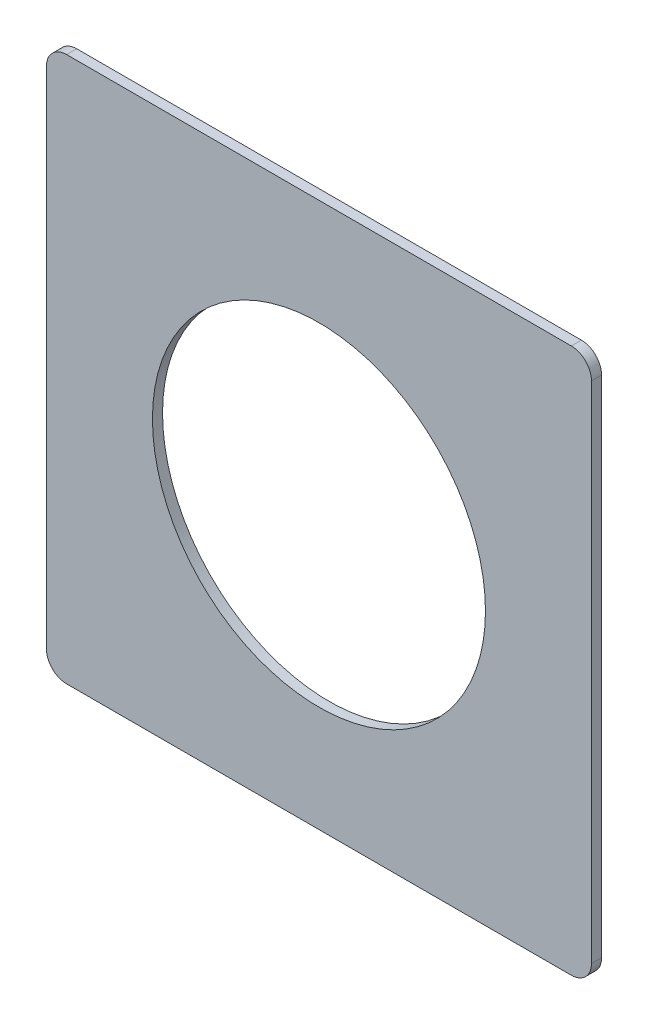
ISO-10303-21;
HEADER;
FILE_DESCRIPTION(('STEP AP214'),'2;1');
FILE_NAME('part.step','',(''),(''),'','','');
FILE_SCHEMA(('AUTOMOTIVE_DESIGN { 1 0 10303 214 1 1 1 1 }'));
ENDSEC;
DATA;
#1=APPLICATION_CONTEXT('core data for automotive mechanical design processes');
#2=APPLICATION_PROTOCOL_DEFINITION('international standard','automotive_design',2000,#1);
#3=PRODUCT_CONTEXT('',#1,'mechanical');
#4=PRODUCT('Part','Part','',(#3));
#5=PRODUCT_RELATED_PRODUCT_CATEGORY('part','',(#4));
#6=PRODUCT_DEFINITION_FORMATION('','',#4);
#7=PRODUCT_DEFINITION_CONTEXT('part definition',#1,'design');
#8=PRODUCT_DEFINITION('design','',#6,#7);
#9=PRODUCT_DEFINITION_SHAPE('','',#8);
#10=(LENGTH_UNIT() NAMED_UNIT(*) SI_UNIT(.MILLI.,.METRE.));
#11=(NAMED_UNIT(*) PLANE_ANGLE_UNIT() SI_UNIT($,.RADIAN.));
#12=(NAMED_UNIT(*) SI_UNIT($,.STERADIAN.) SOLID_ANGLE_UNIT());
#13=UNCERTAINTY_MEASURE_WITH_UNIT(LENGTH_MEASURE(1.E-05),#10,'distance_accuracy_value','');
#14=(GEOMETRIC_REPRESENTATION_CONTEXT(3) GLOBAL_UNCERTAINTY_ASSIGNED_CONTEXT((#13)) GLOBAL_UNIT_ASSIGNED_CONTEXT((#10,
#11,#12)) REPRESENTATION_CONTEXT('',''));
#15=CARTESIAN_POINT('',(0.,0.,0.));
#16=DIRECTION('',(0.,0.,1.));
#17=DIRECTION('',(1.,0.,0.));
#18=AXIS2_PLACEMENT_3D('',#15,#16,#17);
#19=CARTESIAN_POINT('',(158.75,158.75,6.35));
#20=DIRECTION('',(0.,0.,-1.));
#21=DIRECTION('',(-1.,0.,0.));
#22=AXIS2_PLACEMENT_3D('',#19,#20,#21);
#23=CYLINDRICAL_SURFACE('',#22,12.7);
#24=CARTESIAN_POINT('',(158.75,158.75,0.));
#25=DIRECTION('',(0.,0.,1.));
#26=DIRECTION('',(-1.,0.,0.));
#27=AXIS2_PLACEMENT_3D('',#24,#25,#26);
#28=CIRCLE('',#27,12.7);
#29=CARTESIAN_POINT('',(171.45,158.75,0.));
#30=VERTEX_POINT('',#29);
#31=CARTESIAN_POINT('',(158.75,171.45,0.));
#32=VERTEX_POINT('',#31);
#33=EDGE_CURVE('E135',#30,#32,#28,.T.);
#34=ORIENTED_EDGE('',*,*,#33,.T.);
#35=DIRECTION('',(0.,0.,-1.));
#36=VECTOR('',#35,1.);
#37=CARTESIAN_POINT('',(158.75,171.45,6.35));
#38=LINE('',#37,#36);
#39=CARTESIAN_POINT('',(158.75,171.45,6.35));
#40=VERTEX_POINT('',#39);
#41=EDGE_CURVE('E11',#40,#32,#38,.T.);
#42=ORIENTED_EDGE('',*,*,#41,.F.);
#43=CARTESIAN_POINT('',(158.75,158.75,6.35));
#44=DIRECTION('',(0.,0.,1.));
#45=DIRECTION('',(-1.,0.,0.));
#46=AXIS2_PLACEMENT_3D('',#43,#44,#45);
#47=CIRCLE('',#46,12.7);
#48=CARTESIAN_POINT('',(171.45,158.75,6.35));
#49=VERTEX_POINT('',#48);
#50=EDGE_CURVE('E150',#49,#40,#47,.T.);
#51=ORIENTED_EDGE('',*,*,#50,.F.);
#52=DIRECTION('',(0.,0.,-1.));
#53=VECTOR('',#52,1.);
#54=CARTESIAN_POINT('',(171.45,158.75,6.35));
#55=LINE('',#54,#53);
#56=EDGE_CURVE('E131',#49,#30,#55,.T.);
#57=ORIENTED_EDGE('',*,*,#56,.T.);
#58=EDGE_LOOP('',(#34,#42,#51,#57));
#59=FACE_BOUND('',#58,.T.);
#60=ADVANCED_FACE('F39',(#59),#23,.T.);
#61=CARTESIAN_POINT('',(-158.75,171.45,6.35));
#62=DIRECTION('',(0.,-1.,0.));
#63=DIRECTION('',(0.,0.,-1.));
#64=AXIS2_PLACEMENT_3D('',#61,#62,#63);
#65=PLANE('',#64);
#66=DIRECTION('',(-1.,0.,0.));
#67=VECTOR('',#66,1.);
#68=CARTESIAN_POINT('',(-158.75,171.45,0.));
#69=LINE('',#68,#67);
#70=CARTESIAN_POINT('',(-158.75,171.45,0.));
#71=VERTEX_POINT('',#70);
#72=EDGE_CURVE('E138',#32,#71,#69,.T.);
#73=ORIENTED_EDGE('',*,*,#72,.T.);
#74=DIRECTION('',(0.,0.,-1.));
#75=VECTOR('',#74,1.);
#76=CARTESIAN_POINT('',(-158.75,171.45,6.35));
#77=LINE('',#76,#75);
#78=CARTESIAN_POINT('',(-158.75,171.45,6.35));
#79=VERTEX_POINT('',#78);
#80=EDGE_CURVE('E47',#79,#71,#77,.T.);
#81=ORIENTED_EDGE('',*,*,#80,.F.);
#82=DIRECTION('',(-1.,0.,0.));
#83=VECTOR('',#82,1.);
#84=CARTESIAN_POINT('',(-158.75,171.45,6.35));
#85=LINE('',#84,#83);
#86=EDGE_CURVE('E98',#40,#79,#85,.T.);
#87=ORIENTED_EDGE('',*,*,#86,.F.);
#88=ORIENTED_EDGE('',*,*,#41,.T.);
#89=EDGE_LOOP('',(#73,#81,#87,#88));
#90=FACE_BOUND('',#89,.T.);
#91=ADVANCED_FACE('F206',(#90),#65,.F.);
#92=CARTESIAN_POINT('',(-158.75,158.75,6.35));
#93=DIRECTION('',(0.,0.,-1.));
#94=DIRECTION('',(-1.,0.,0.));
#95=AXIS2_PLACEMENT_3D('',#92,#93,#94);
#96=CYLINDRICAL_SURFACE('',#95,12.7);
#97=CARTESIAN_POINT('',(-158.75,158.75,0.));
#98=DIRECTION('',(0.,0.,1.));
#99=DIRECTION('',(1.,0.,0.));
#100=AXIS2_PLACEMENT_3D('',#97,#98,#99);
#101=CIRCLE('',#100,12.7);
#102=CARTESIAN_POINT('',(-171.45,158.75,0.));
#103=VERTEX_POINT('',#102);
#104=EDGE_CURVE('E141',#71,#103,#101,.T.);
#105=ORIENTED_EDGE('',*,*,#104,.T.);
#106=DIRECTION('',(0.,0.,-1.));
#107=VECTOR('',#106,1.);
#108=CARTESIAN_POINT('',(-171.45,158.75,6.35));
#109=LINE('',#108,#107);
#110=CARTESIAN_POINT('',(-171.45,158.75,6.35));
#111=VERTEX_POINT('',#110);
#112=EDGE_CURVE('E157',#111,#103,#109,.T.);
#113=ORIENTED_EDGE('',*,*,#112,.F.);
#114=CARTESIAN_POINT('',(-158.75,158.75,6.35));
#115=DIRECTION('',(0.,0.,1.));
#116=DIRECTION('',(1.,0.,0.));
#117=AXIS2_PLACEMENT_3D('',#114,#115,#116);
#118=CIRCLE('',#117,12.7);
#119=EDGE_CURVE('E165',#79,#111,#118,.T.);
#120=ORIENTED_EDGE('',*,*,#119,.F.);
#121=ORIENTED_EDGE('',*,*,#80,.T.);
#122=EDGE_LOOP('',(#105,#113,#120,#121));
#123=FACE_BOUND('',#122,.T.);
#124=ADVANCED_FACE('F163',(#123),#96,.T.);
#125=CARTESIAN_POINT('',(-171.45,158.75,6.35));
#126=DIRECTION('',(1.,0.,0.));
#127=DIRECTION('',(0.,0.,-1.));
#128=AXIS2_PLACEMENT_3D('',#125,#126,#127);
#129=PLANE('',#128);
#130=DIRECTION('',(0.,-1.,0.));
#131=VECTOR('',#130,1.);
#132=CARTESIAN_POINT('',(-171.45,158.75,0.));
#133=LINE('',#132,#131);
#134=CARTESIAN_POINT('',(-171.45,-158.75,0.));
#135=VERTEX_POINT('',#134);
#136=EDGE_CURVE('E143',#103,#135,#133,.T.);
#137=ORIENTED_EDGE('',*,*,#136,.T.);
#138=DIRECTION('',(0.,0.,-1.));
#139=VECTOR('',#138,1.);
#140=CARTESIAN_POINT('',(-171.45,-158.75,6.35));
#141=LINE('',#140,#139);
#142=CARTESIAN_POINT('',(-171.45,-158.75,6.35));
#143=VERTEX_POINT('',#142);
#144=EDGE_CURVE('E154',#143,#135,#141,.T.);
#145=ORIENTED_EDGE('',*,*,#144,.F.);
#146=DIRECTION('',(0.,-1.,0.));
#147=VECTOR('',#146,1.);
#148=CARTESIAN_POINT('',(-171.45,158.75,6.35));
#149=LINE('',#148,#147);
#150=EDGE_CURVE('E177',#111,#143,#149,.T.);
#151=ORIENTED_EDGE('',*,*,#150,.F.);
#152=ORIENTED_EDGE('',*,*,#112,.T.);
#153=EDGE_LOOP('',(#137,#145,#151,#152));
#154=FACE_BOUND('',#153,.T.);
#155=ADVANCED_FACE('F173',(#154),#129,.F.);
#156=CARTESIAN_POINT('',(-158.75,-158.75,6.35));
#157=DIRECTION('',(0.,0.,-1.));
#158=DIRECTION('',(-1.,0.,0.));
#159=AXIS2_PLACEMENT_3D('',#156,#157,#158);
#160=CYLINDRICAL_SURFACE('',#159,12.7);
#161=CARTESIAN_POINT('',(-158.75,-158.75,0.));
#162=DIRECTION('',(0.,0.,1.));
#163=DIRECTION('',(1.,0.,0.));
#164=AXIS2_PLACEMENT_3D('',#161,#162,#163);
#165=CIRCLE('',#164,12.7);
#166=CARTESIAN_POINT('',(-158.75,-171.45,0.));
#167=VERTEX_POINT('',#166);
#168=EDGE_CURVE('E145',#135,#167,#165,.T.);
#169=ORIENTED_EDGE('',*,*,#168,.T.);
#170=DIRECTION('',(0.,0.,-1.));
#171=VECTOR('',#170,1.);
#172=CARTESIAN_POINT('',(-158.75,-171.45,6.35));
#173=LINE('',#172,#171);
#174=CARTESIAN_POINT('',(-158.75,-171.45,6.35));
#175=VERTEX_POINT('',#174);
#176=EDGE_CURVE('E126',#175,#167,#173,.T.);
#177=ORIENTED_EDGE('',*,*,#176,.F.);
#178=CARTESIAN_POINT('',(-158.75,-158.75,6.35));
#179=DIRECTION('',(0.,0.,1.));
#180=DIRECTION('',(1.,0.,0.));
#181=AXIS2_PLACEMENT_3D('',#178,#179,#180);
#182=CIRCLE('',#181,12.7);
#183=EDGE_CURVE('E117',#143,#175,#182,.T.);
#184=ORIENTED_EDGE('',*,*,#183,.F.);
#185=ORIENTED_EDGE('',*,*,#144,.T.);
#186=EDGE_LOOP('',(#169,#177,#184,#185));
#187=FACE_BOUND('',#186,.T.);
#188=ADVANCED_FACE('F176',(#187),#160,.T.);
#189=CARTESIAN_POINT('',(-158.75,-171.45,6.35));
#190=DIRECTION('',(0.,1.,0.));
#191=DIRECTION('',(0.,0.,1.));
#192=AXIS2_PLACEMENT_3D('',#189,#190,#191);
#193=PLANE('',#192);
#194=DIRECTION('',(1.,0.,0.));
#195=VECTOR('',#194,1.);
#196=CARTESIAN_POINT('',(-158.75,-171.45,0.));
#197=LINE('',#196,#195);
#198=CARTESIAN_POINT('',(158.75,-171.45,0.));
#199=VERTEX_POINT('',#198);
#200=EDGE_CURVE('E125',#167,#199,#197,.T.);
#201=ORIENTED_EDGE('',*,*,#200,.T.);
#202=DIRECTION('',(0.,0.,-1.));
#203=VECTOR('',#202,1.);
#204=CARTESIAN_POINT('',(158.75,-171.45,6.35));
#205=LINE('',#204,#203);
#206=CARTESIAN_POINT('',(158.75,-171.45,6.35));
#207=VERTEX_POINT('',#206);
#208=EDGE_CURVE('E122',#207,#199,#205,.T.);
#209=ORIENTED_EDGE('',*,*,#208,.F.);
#210=DIRECTION('',(1.,0.,0.));
#211=VECTOR('',#210,1.);
#212=CARTESIAN_POINT('',(-158.75,-171.45,6.35));
#213=LINE('',#212,#211);
#214=EDGE_CURVE('E111',#175,#207,#213,.T.);
#215=ORIENTED_EDGE('',*,*,#214,.F.);
#216=ORIENTED_EDGE('',*,*,#176,.T.);
#217=EDGE_LOOP('',(#201,#209,#215,#216));
#218=FACE_BOUND('',#217,.T.);
#219=ADVANCED_FACE('F123',(#218),#193,.F.);
#220=CARTESIAN_POINT('',(158.75,-158.75,6.35));
#221=DIRECTION('',(0.,0.,-1.));
#222=DIRECTION('',(-1.,0.,0.));
#223=AXIS2_PLACEMENT_3D('',#220,#221,#222);
#224=CYLINDRICAL_SURFACE('',#223,12.7);
#225=CARTESIAN_POINT('',(158.75,-158.75,0.));
#226=DIRECTION('',(0.,0.,1.));
#227=DIRECTION('',(1.,0.,0.));
#228=AXIS2_PLACEMENT_3D('',#225,#226,#227);
#229=CIRCLE('',#228,12.7);
#230=CARTESIAN_POINT('',(171.45,-158.75,0.));
#231=VERTEX_POINT('',#230);
#232=EDGE_CURVE('E84',#199,#231,#229,.T.);
#233=ORIENTED_EDGE('',*,*,#232,.T.);
#234=DIRECTION('',(0.,0.,-1.));
#235=VECTOR('',#234,1.);
#236=CARTESIAN_POINT('',(171.45,-158.75,6.35));
#237=LINE('',#236,#235);
#238=CARTESIAN_POINT('',(171.45,-158.75,6.35));
#239=VERTEX_POINT('',#238);
#240=EDGE_CURVE('E127',#239,#231,#237,.T.);
#241=ORIENTED_EDGE('',*,*,#240,.F.);
#242=CARTESIAN_POINT('',(158.75,-158.75,6.35));
#243=DIRECTION('',(0.,0.,1.));
#244=DIRECTION('',(1.,0.,0.));
#245=AXIS2_PLACEMENT_3D('',#242,#243,#244);
#246=CIRCLE('',#245,12.7);
#247=EDGE_CURVE('E115',#207,#239,#246,.T.);
#248=ORIENTED_EDGE('',*,*,#247,.F.);
#249=ORIENTED_EDGE('',*,*,#208,.T.);
#250=EDGE_LOOP('',(#233,#241,#248,#249));
#251=FACE_BOUND('',#250,.T.);
#252=ADVANCED_FACE('F129',(#251),#224,.T.);
#253=CARTESIAN_POINT('',(171.45,158.75,6.35));
#254=DIRECTION('',(-1.,0.,0.));
#255=DIRECTION('',(0.,0.,1.));
#256=AXIS2_PLACEMENT_3D('',#253,#254,#255);
#257=PLANE('',#256);
#258=DIRECTION('',(0.,1.,0.));
#259=VECTOR('',#258,1.);
#260=CARTESIAN_POINT('',(171.45,158.75,0.));
#261=LINE('',#260,#259);
#262=EDGE_CURVE('E90',#231,#30,#261,.T.);
#263=ORIENTED_EDGE('',*,*,#262,.T.);
#264=ORIENTED_EDGE('',*,*,#56,.F.);
#265=DIRECTION('',(0.,1.,0.));
#266=VECTOR('',#265,1.);
#267=CARTESIAN_POINT('',(171.45,158.75,6.35));
#268=LINE('',#267,#266);
#269=EDGE_CURVE('E55',#239,#49,#268,.T.);
#270=ORIENTED_EDGE('',*,*,#269,.F.);
#271=ORIENTED_EDGE('',*,*,#240,.T.);
#272=EDGE_LOOP('',(#263,#264,#270,#271));
#273=FACE_BOUND('',#272,.T.);
#274=ADVANCED_FACE('F197',(#273),#257,.F.);
#275=CARTESIAN_POINT('',(158.75,158.75,6.35));
#276=DIRECTION('',(0.,0.,-1.));
#277=DIRECTION('',(-1.,0.,0.));
#278=AXIS2_PLACEMENT_3D('',#275,#276,#277);
#279=PLANE('',#278);
#280=CARTESIAN_POINT('',(0.,0.,6.35));
#281=DIRECTION('',(0.,0.,1.));
#282=DIRECTION('',(1.,0.,0.));
#283=AXIS2_PLACEMENT_3D('',#280,#281,#282);
#284=CIRCLE('',#283,104.764774546973);
#285=CARTESIAN_POINT('',(104.764774546973,0.,6.35));
#286=VERTEX_POINT('',#285);
#287=EDGE_CURVE('E183',#286,#286,#284,.T.);
#288=ORIENTED_EDGE('',*,*,#287,.F.);
#289=EDGE_LOOP('',(#288));
#290=FACE_BOUND('',#289,.T.);
#291=ORIENTED_EDGE('',*,*,#50,.T.);
#292=ORIENTED_EDGE('',*,*,#86,.T.);
#293=ORIENTED_EDGE('',*,*,#119,.T.);
#294=ORIENTED_EDGE('',*,*,#150,.T.);
#295=ORIENTED_EDGE('',*,*,#183,.T.);
#296=ORIENTED_EDGE('',*,*,#214,.T.);
#297=ORIENTED_EDGE('',*,*,#247,.T.);
#298=ORIENTED_EDGE('',*,*,#269,.T.);
#299=EDGE_LOOP('',(#291,#292,#293,#294,#295,#296,#297,#298));
#300=FACE_BOUND('',#299,.T.);
#301=ADVANCED_FACE('F113',(#290,#300),#279,.F.);
#302=CARTESIAN_POINT('',(158.75,158.75,0.));
#303=DIRECTION('',(0.,0.,-1.));
#304=DIRECTION('',(-1.,0.,0.));
#305=AXIS2_PLACEMENT_3D('',#302,#303,#304);
#306=PLANE('',#305);
#307=CARTESIAN_POINT('',(0.,0.,0.));
#308=DIRECTION('',(0.,0.,1.));
#309=DIRECTION('',(1.,0.,0.));
#310=AXIS2_PLACEMENT_3D('',#307,#308,#309);
#311=CIRCLE('',#310,104.764774546973);
#312=CARTESIAN_POINT('',(104.764774546973,0.,0.));
#313=VERTEX_POINT('',#312);
#314=EDGE_CURVE('E139',#313,#313,#311,.T.);
#315=ORIENTED_EDGE('',*,*,#314,.T.);
#316=EDGE_LOOP('',(#315));
#317=FACE_BOUND('',#316,.T.);
#318=ORIENTED_EDGE('',*,*,#33,.F.);
#319=ORIENTED_EDGE('',*,*,#262,.F.);
#320=ORIENTED_EDGE('',*,*,#232,.F.);
#321=ORIENTED_EDGE('',*,*,#200,.F.);
#322=ORIENTED_EDGE('',*,*,#168,.F.);
#323=ORIENTED_EDGE('',*,*,#136,.F.);
#324=ORIENTED_EDGE('',*,*,#104,.F.);
#325=ORIENTED_EDGE('',*,*,#72,.F.);
#326=EDGE_LOOP('',(#318,#319,#320,#321,#322,#323,#324,#325));
#327=FACE_BOUND('',#326,.T.);
#328=ADVANCED_FACE('F169',(#317,#327),#306,.T.);
#329=CARTESIAN_POINT('',(0.,0.,0.));
#330=DIRECTION('',(0.,0.,1.));
#331=DIRECTION('',(1.,0.,0.));
#332=AXIS2_PLACEMENT_3D('',#329,#330,#331);
#333=CYLINDRICAL_SURFACE('',#332,104.764774546973);
#334=ORIENTED_EDGE('',*,*,#314,.F.);
#335=EDGE_LOOP('',(#334));
#336=FACE_BOUND('',#335,.T.);
#337=ORIENTED_EDGE('',*,*,#287,.T.);
#338=EDGE_LOOP('',(#337));
#339=FACE_BOUND('',#338,.T.);
#340=ADVANCED_FACE('F190',(#336,#339),#333,.F.);
#341=CLOSED_SHELL('',(#60,#91,#124,#155,#188,#219,#252,#274,#301,#328,#340));
#342=MANIFOLD_SOLID_BREP('B2',#341);
#343=ADVANCED_BREP_SHAPE_REPRESENTATION('',(#18,#342),#14);
#344=SHAPE_DEFINITION_REPRESENTATION(#9,#343);
ENDSEC;
END-ISO-10303-21;
